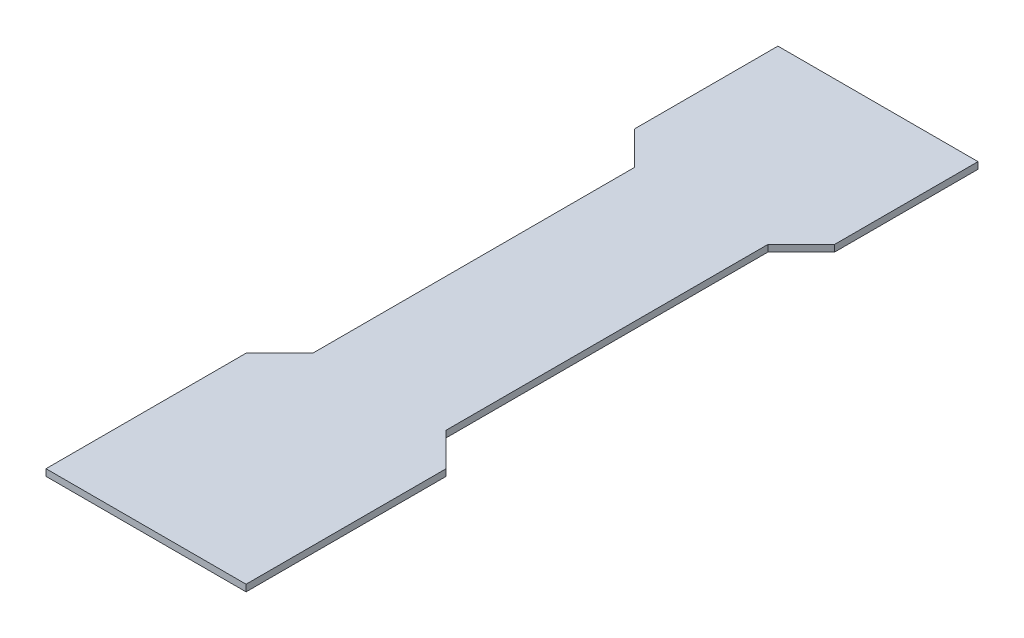
ISO-10303-21;
HEADER;
FILE_DESCRIPTION(('STEP AP214'),'2;1');
FILE_NAME('part.step','',(''),(''),'','','');
FILE_SCHEMA(('AUTOMOTIVE_DESIGN { 1 0 10303 214 1 1 1 1 }'));
ENDSEC;
DATA;
#1=APPLICATION_CONTEXT('core data for automotive mechanical design processes');
#2=APPLICATION_PROTOCOL_DEFINITION('international standard','automotive_design',2000,#1);
#3=PRODUCT_CONTEXT('',#1,'mechanical');
#4=PRODUCT('Part','Part','',(#3));
#5=PRODUCT_RELATED_PRODUCT_CATEGORY('part','',(#4));
#6=PRODUCT_DEFINITION_FORMATION('','',#4);
#7=PRODUCT_DEFINITION_CONTEXT('part definition',#1,'design');
#8=PRODUCT_DEFINITION('design','',#6,#7);
#9=PRODUCT_DEFINITION_SHAPE('','',#8);
#10=(LENGTH_UNIT() NAMED_UNIT(*) SI_UNIT(.MILLI.,.METRE.));
#11=(NAMED_UNIT(*) PLANE_ANGLE_UNIT() SI_UNIT($,.RADIAN.));
#12=(NAMED_UNIT(*) SI_UNIT($,.STERADIAN.) SOLID_ANGLE_UNIT());
#13=UNCERTAINTY_MEASURE_WITH_UNIT(LENGTH_MEASURE(1.E-05),#10,'distance_accuracy_value','');
#14=(GEOMETRIC_REPRESENTATION_CONTEXT(3) GLOBAL_UNCERTAINTY_ASSIGNED_CONTEXT((#13)) GLOBAL_UNIT_ASSIGNED_CONTEXT((#10,
#11,#12)) REPRESENTATION_CONTEXT('',''));
#15=CARTESIAN_POINT('',(0.,0.,0.));
#16=DIRECTION('',(0.,0.,1.));
#17=DIRECTION('',(1.,0.,0.));
#18=AXIS2_PLACEMENT_3D('',#15,#16,#17);
#19=CARTESIAN_POINT('',(-30.0000000000001,2.,260.));
#20=DIRECTION('',(0.707106781186549,0.,0.707106781186546));
#21=DIRECTION('',(0.707106781186546,0.,-0.707106781186549));
#22=AXIS2_PLACEMENT_3D('',#19,#20,#21);
#23=PLANE('',#22);
#24=DIRECTION('',(-0.707106781186546,0.,0.707106781186549));
#25=VECTOR('',#24,1.);
#26=CARTESIAN_POINT('',(-30.0000000000001,0.,260.));
#27=LINE('',#26,#25);
#28=CARTESIAN_POINT('',(-20.,0.,250.));
#29=VERTEX_POINT('',#28);
#30=CARTESIAN_POINT('',(-30.0000000000001,0.,260.));
#31=VERTEX_POINT('',#30);
#32=EDGE_CURVE('E168',#29,#31,#27,.T.);
#33=ORIENTED_EDGE('',*,*,#32,.T.);
#34=DIRECTION('',(0.,-1.,0.));
#35=VECTOR('',#34,1.);
#36=CARTESIAN_POINT('',(-30.0000000000001,2.,260.));
#37=LINE('',#36,#35);
#38=CARTESIAN_POINT('',(-30.0000000000001,2.,260.));
#39=VERTEX_POINT('',#38);
#40=EDGE_CURVE('E48',#39,#31,#37,.T.);
#41=ORIENTED_EDGE('',*,*,#40,.F.);
#42=DIRECTION('',(-0.707106781186546,0.,0.707106781186549));
#43=VECTOR('',#42,1.);
#44=CARTESIAN_POINT('',(-30.0000000000001,2.,260.));
#45=LINE('',#44,#43);
#46=CARTESIAN_POINT('',(-20.,2.,250.));
#47=VERTEX_POINT('',#46);
#48=EDGE_CURVE('E112',#47,#39,#45,.T.);
#49=ORIENTED_EDGE('',*,*,#48,.F.);
#50=DIRECTION('',(0.,-1.,0.));
#51=VECTOR('',#50,1.);
#52=CARTESIAN_POINT('',(-20.,2.,250.));
#53=LINE('',#52,#51);
#54=EDGE_CURVE('E11',#47,#29,#53,.T.);
#55=ORIENTED_EDGE('',*,*,#54,.T.);
#56=EDGE_LOOP('',(#33,#41,#49,#55));
#57=FACE_BOUND('',#56,.T.);
#58=ADVANCED_FACE('F39',(#57),#23,.F.);
#59=CARTESIAN_POINT('',(-30.0000000000001,2.,260.));
#60=DIRECTION('',(1.,0.,0.));
#61=DIRECTION('',(0.,0.,-1.));
#62=AXIS2_PLACEMENT_3D('',#59,#60,#61);
#63=PLANE('',#62);
#64=DIRECTION('',(0.,0.,1.));
#65=VECTOR('',#64,1.);
#66=CARTESIAN_POINT('',(-30.0000000000001,0.,260.));
#67=LINE('',#66,#65);
#68=CARTESIAN_POINT('',(-30.,0.,320.));
#69=VERTEX_POINT('',#68);
#70=EDGE_CURVE('E171',#31,#69,#67,.T.);
#71=ORIENTED_EDGE('',*,*,#70,.T.);
#72=DIRECTION('',(0.,-1.,0.));
#73=VECTOR('',#72,1.);
#74=CARTESIAN_POINT('',(-30.,2.,320.));
#75=LINE('',#74,#73);
#76=CARTESIAN_POINT('',(-30.,2.,320.));
#77=VERTEX_POINT('',#76);
#78=EDGE_CURVE('E228',#77,#69,#75,.T.);
#79=ORIENTED_EDGE('',*,*,#78,.F.);
#80=DIRECTION('',(0.,0.,1.));
#81=VECTOR('',#80,1.);
#82=CARTESIAN_POINT('',(-30.0000000000001,2.,260.));
#83=LINE('',#82,#81);
#84=EDGE_CURVE('E238',#39,#77,#83,.T.);
#85=ORIENTED_EDGE('',*,*,#84,.F.);
#86=ORIENTED_EDGE('',*,*,#40,.T.);
#87=EDGE_LOOP('',(#71,#79,#85,#86));
#88=FACE_BOUND('',#87,.T.);
#89=ADVANCED_FACE('F236',(#88),#63,.F.);
#90=CARTESIAN_POINT('',(-30.,2.,320.));
#91=DIRECTION('',(0.,0.,-1.));
#92=DIRECTION('',(-1.,0.,0.));
#93=AXIS2_PLACEMENT_3D('',#90,#91,#92);
#94=PLANE('',#93);
#95=DIRECTION('',(1.,0.,0.));
#96=VECTOR('',#95,1.);
#97=CARTESIAN_POINT('',(-30.,0.,320.));
#98=LINE('',#97,#96);
#99=CARTESIAN_POINT('',(30.,0.,320.));
#100=VERTEX_POINT('',#99);
#101=EDGE_CURVE('E174',#69,#100,#98,.T.);
#102=ORIENTED_EDGE('',*,*,#101,.T.);
#103=DIRECTION('',(0.,-1.,0.));
#104=VECTOR('',#103,1.);
#105=CARTESIAN_POINT('',(30.,2.,320.));
#106=LINE('',#105,#104);
#107=CARTESIAN_POINT('',(30.,2.,320.));
#108=VERTEX_POINT('',#107);
#109=EDGE_CURVE('E224',#108,#100,#106,.T.);
#110=ORIENTED_EDGE('',*,*,#109,.F.);
#111=DIRECTION('',(1.,0.,0.));
#112=VECTOR('',#111,1.);
#113=CARTESIAN_POINT('',(-30.,2.,320.));
#114=LINE('',#113,#112);
#115=EDGE_CURVE('E258',#77,#108,#114,.T.);
#116=ORIENTED_EDGE('',*,*,#115,.F.);
#117=ORIENTED_EDGE('',*,*,#78,.T.);
#118=EDGE_LOOP('',(#102,#110,#116,#117));
#119=FACE_BOUND('',#118,.T.);
#120=ADVANCED_FACE('F248',(#119),#94,.F.);
#121=CARTESIAN_POINT('',(30.0000000000001,2.,260.));
#122=DIRECTION('',(-1.,0.,0.));
#123=DIRECTION('',(0.,0.,1.));
#124=AXIS2_PLACEMENT_3D('',#121,#122,#123);
#125=PLANE('',#124);
#126=DIRECTION('',(0.,0.,-1.));
#127=VECTOR('',#126,1.);
#128=CARTESIAN_POINT('',(30.0000000000001,0.,260.));
#129=LINE('',#128,#127);
#130=CARTESIAN_POINT('',(30.0000000000001,0.,260.));
#131=VERTEX_POINT('',#130);
#132=EDGE_CURVE('E177',#100,#131,#129,.T.);
#133=ORIENTED_EDGE('',*,*,#132,.T.);
#134=DIRECTION('',(0.,-1.,0.));
#135=VECTOR('',#134,1.);
#136=CARTESIAN_POINT('',(30.0000000000001,2.,260.));
#137=LINE('',#136,#135);
#138=CARTESIAN_POINT('',(30.0000000000001,2.,260.));
#139=VERTEX_POINT('',#138);
#140=EDGE_CURVE('E220',#139,#131,#137,.T.);
#141=ORIENTED_EDGE('',*,*,#140,.F.);
#142=DIRECTION('',(0.,0.,-1.));
#143=VECTOR('',#142,1.);
#144=CARTESIAN_POINT('',(30.0000000000001,2.,260.));
#145=LINE('',#144,#143);
#146=EDGE_CURVE('E254',#108,#139,#145,.T.);
#147=ORIENTED_EDGE('',*,*,#146,.F.);
#148=ORIENTED_EDGE('',*,*,#109,.T.);
#149=EDGE_LOOP('',(#133,#141,#147,#148));
#150=FACE_BOUND('',#149,.T.);
#151=ADVANCED_FACE('F252',(#150),#125,.F.);
#152=CARTESIAN_POINT('',(30.0000000000001,2.,260.));
#153=DIRECTION('',(-0.707106781186549,0.,0.707106781186546));
#154=DIRECTION('',(0.707106781186546,0.,0.707106781186549));
#155=AXIS2_PLACEMENT_3D('',#152,#153,#154);
#156=PLANE('',#155);
#157=DIRECTION('',(-0.707106781186546,0.,-0.707106781186549));
#158=VECTOR('',#157,1.);
#159=CARTESIAN_POINT('',(30.0000000000001,0.,260.));
#160=LINE('',#159,#158);
#161=CARTESIAN_POINT('',(20.,0.,250.));
#162=VERTEX_POINT('',#161);
#163=EDGE_CURVE('E180',#131,#162,#160,.T.);
#164=ORIENTED_EDGE('',*,*,#163,.T.);
#165=DIRECTION('',(0.,-1.,0.));
#166=VECTOR('',#165,1.);
#167=CARTESIAN_POINT('',(20.,2.,250.));
#168=LINE('',#167,#166);
#169=CARTESIAN_POINT('',(20.,2.,250.));
#170=VERTEX_POINT('',#169);
#171=EDGE_CURVE('E216',#170,#162,#168,.T.);
#172=ORIENTED_EDGE('',*,*,#171,.F.);
#173=DIRECTION('',(-0.707106781186546,0.,-0.707106781186549));
#174=VECTOR('',#173,1.);
#175=CARTESIAN_POINT('',(30.0000000000001,2.,260.));
#176=LINE('',#175,#174);
#177=EDGE_CURVE('E257',#139,#170,#176,.T.);
#178=ORIENTED_EDGE('',*,*,#177,.F.);
#179=ORIENTED_EDGE('',*,*,#140,.T.);
#180=EDGE_LOOP('',(#164,#172,#178,#179));
#181=FACE_BOUND('',#180,.T.);
#182=ADVANCED_FACE('F308',(#181),#156,.F.);
#183=CARTESIAN_POINT('',(20.,2.,240.));
#184=DIRECTION('',(-1.,0.,0.));
#185=DIRECTION('',(0.,0.,1.));
#186=AXIS2_PLACEMENT_3D('',#183,#184,#185);
#187=PLANE('',#186);
#188=DIRECTION('',(0.,0.,-1.));
#189=VECTOR('',#188,1.);
#190=CARTESIAN_POINT('',(20.,0.,240.));
#191=LINE('',#190,#189);
#192=CARTESIAN_POINT('',(20.,0.,153.5));
#193=VERTEX_POINT('',#192);
#194=EDGE_CURVE('E184',#162,#193,#191,.T.);
#195=ORIENTED_EDGE('',*,*,#194,.T.);
#196=DIRECTION('',(0.,-1.,0.));
#197=VECTOR('',#196,1.);
#198=CARTESIAN_POINT('',(20.,2.,153.5));
#199=LINE('',#198,#197);
#200=CARTESIAN_POINT('',(20.,2.,153.5));
#201=VERTEX_POINT('',#200);
#202=EDGE_CURVE('E212',#201,#193,#199,.T.);
#203=ORIENTED_EDGE('',*,*,#202,.F.);
#204=DIRECTION('',(0.,0.,-1.));
#205=VECTOR('',#204,1.);
#206=CARTESIAN_POINT('',(20.,2.,250.));
#207=LINE('',#206,#205);
#208=EDGE_CURVE('E262',#170,#201,#207,.T.);
#209=ORIENTED_EDGE('',*,*,#208,.F.);
#210=ORIENTED_EDGE('',*,*,#171,.T.);
#211=EDGE_LOOP('',(#195,#203,#209,#210));
#212=FACE_BOUND('',#211,.T.);
#213=ADVANCED_FACE('F311',(#212),#187,.F.);
#214=CARTESIAN_POINT('',(30.,2.,143.5));
#215=DIRECTION('',(-0.707106781186539,0.,-0.707106781186556));
#216=DIRECTION('',(-0.707106781186556,0.,0.707106781186539));
#217=AXIS2_PLACEMENT_3D('',#214,#215,#216);
#218=PLANE('',#217);
#219=DIRECTION('',(0.707106781186556,0.,-0.707106781186539));
#220=VECTOR('',#219,1.);
#221=CARTESIAN_POINT('',(30.,0.,143.5));
#222=LINE('',#221,#220);
#223=CARTESIAN_POINT('',(30.,0.,143.5));
#224=VERTEX_POINT('',#223);
#225=EDGE_CURVE('E187',#193,#224,#222,.T.);
#226=ORIENTED_EDGE('',*,*,#225,.T.);
#227=DIRECTION('',(0.,-1.,0.));
#228=VECTOR('',#227,1.);
#229=CARTESIAN_POINT('',(30.,2.,143.5));
#230=LINE('',#229,#228);
#231=CARTESIAN_POINT('',(30.,2.,143.5));
#232=VERTEX_POINT('',#231);
#233=EDGE_CURVE('E208',#232,#224,#230,.T.);
#234=ORIENTED_EDGE('',*,*,#233,.F.);
#235=DIRECTION('',(0.707106781186556,0.,-0.707106781186539));
#236=VECTOR('',#235,1.);
#237=CARTESIAN_POINT('',(30.,2.,143.5));
#238=LINE('',#237,#236);
#239=EDGE_CURVE('E269',#201,#232,#238,.T.);
#240=ORIENTED_EDGE('',*,*,#239,.F.);
#241=ORIENTED_EDGE('',*,*,#202,.T.);
#242=EDGE_LOOP('',(#226,#234,#240,#241));
#243=FACE_BOUND('',#242,.T.);
#244=ADVANCED_FACE('F277',(#243),#218,.F.);
#245=CARTESIAN_POINT('',(30.,2.,143.5));
#246=DIRECTION('',(-1.,0.,0.));
#247=DIRECTION('',(0.,0.,1.));
#248=AXIS2_PLACEMENT_3D('',#245,#246,#247);
#249=PLANE('',#248);
#250=DIRECTION('',(0.,0.,-1.));
#251=VECTOR('',#250,1.);
#252=CARTESIAN_POINT('',(30.,0.,143.5));
#253=LINE('',#252,#251);
#254=CARTESIAN_POINT('',(29.9999999999998,0.,100.5));
#255=VERTEX_POINT('',#254);
#256=EDGE_CURVE('E190',#224,#255,#253,.T.);
#257=ORIENTED_EDGE('',*,*,#256,.T.);
#258=DIRECTION('',(0.,-1.,0.));
#259=VECTOR('',#258,1.);
#260=CARTESIAN_POINT('',(29.9999999999998,2.,100.5));
#261=LINE('',#260,#259);
#262=CARTESIAN_POINT('',(29.9999999999998,2.,100.5));
#263=VERTEX_POINT('',#262);
#264=EDGE_CURVE('E155',#263,#255,#261,.T.);
#265=ORIENTED_EDGE('',*,*,#264,.F.);
#266=DIRECTION('',(0.,0.,-1.));
#267=VECTOR('',#266,1.);
#268=CARTESIAN_POINT('',(30.,2.,143.5));
#269=LINE('',#268,#267);
#270=EDGE_CURVE('E144',#232,#263,#269,.T.);
#271=ORIENTED_EDGE('',*,*,#270,.F.);
#272=ORIENTED_EDGE('',*,*,#233,.T.);
#273=EDGE_LOOP('',(#257,#265,#271,#272));
#274=FACE_BOUND('',#273,.T.);
#275=ADVANCED_FACE('F281',(#274),#249,.F.);
#276=CARTESIAN_POINT('',(-29.9999999999998,2.,100.5));
#277=DIRECTION('',(0.,0.,1.));
#278=DIRECTION('',(1.,0.,0.));
#279=AXIS2_PLACEMENT_3D('',#276,#277,#278);
#280=PLANE('',#279);
#281=DIRECTION('',(-1.,0.,0.));
#282=VECTOR('',#281,1.);
#283=CARTESIAN_POINT('',(-29.9999999999998,0.,100.5));
#284=LINE('',#283,#282);
#285=CARTESIAN_POINT('',(-29.9999999999998,0.,100.5));
#286=VERTEX_POINT('',#285);
#287=EDGE_CURVE('E153',#255,#286,#284,.T.);
#288=ORIENTED_EDGE('',*,*,#287,.T.);
#289=DIRECTION('',(0.,-1.,0.));
#290=VECTOR('',#289,1.);
#291=CARTESIAN_POINT('',(-29.9999999999998,2.,100.5));
#292=LINE('',#291,#290);
#293=CARTESIAN_POINT('',(-29.9999999999998,2.,100.5));
#294=VERTEX_POINT('',#293);
#295=EDGE_CURVE('E150',#294,#286,#292,.T.);
#296=ORIENTED_EDGE('',*,*,#295,.F.);
#297=DIRECTION('',(-1.,0.,0.));
#298=VECTOR('',#297,1.);
#299=CARTESIAN_POINT('',(-29.9999999999998,2.,100.5));
#300=LINE('',#299,#298);
#301=EDGE_CURVE('E138',#263,#294,#300,.T.);
#302=ORIENTED_EDGE('',*,*,#301,.F.);
#303=ORIENTED_EDGE('',*,*,#264,.T.);
#304=EDGE_LOOP('',(#288,#296,#302,#303));
#305=FACE_BOUND('',#304,.T.);
#306=ADVANCED_FACE('F151',(#305),#280,.F.);
#307=CARTESIAN_POINT('',(-30.,2.,143.5));
#308=DIRECTION('',(1.,0.,0.));
#309=DIRECTION('',(0.,0.,-1.));
#310=AXIS2_PLACEMENT_3D('',#307,#308,#309);
#311=PLANE('',#310);
#312=DIRECTION('',(0.,0.,1.));
#313=VECTOR('',#312,1.);
#314=CARTESIAN_POINT('',(-30.,0.,143.5));
#315=LINE('',#314,#313);
#316=CARTESIAN_POINT('',(-30.,0.,143.5));
#317=VERTEX_POINT('',#316);
#318=EDGE_CURVE('E98',#286,#317,#315,.T.);
#319=ORIENTED_EDGE('',*,*,#318,.T.);
#320=DIRECTION('',(0.,-1.,0.));
#321=VECTOR('',#320,1.);
#322=CARTESIAN_POINT('',(-30.,2.,143.5));
#323=LINE('',#322,#321);
#324=CARTESIAN_POINT('',(-30.,2.,143.5));
#325=VERTEX_POINT('',#324);
#326=EDGE_CURVE('E156',#325,#317,#323,.T.);
#327=ORIENTED_EDGE('',*,*,#326,.F.);
#328=DIRECTION('',(0.,0.,1.));
#329=VECTOR('',#328,1.);
#330=CARTESIAN_POINT('',(-30.,2.,143.5));
#331=LINE('',#330,#329);
#332=EDGE_CURVE('E142',#294,#325,#331,.T.);
#333=ORIENTED_EDGE('',*,*,#332,.F.);
#334=ORIENTED_EDGE('',*,*,#295,.T.);
#335=EDGE_LOOP('',(#319,#327,#333,#334));
#336=FACE_BOUND('',#335,.T.);
#337=ADVANCED_FACE('F158',(#336),#311,.F.);
#338=CARTESIAN_POINT('',(-30.,2.,143.5));
#339=DIRECTION('',(0.707106781186539,0.,-0.707106781186556));
#340=DIRECTION('',(-0.707106781186556,0.,-0.707106781186539));
#341=AXIS2_PLACEMENT_3D('',#338,#339,#340);
#342=PLANE('',#341);
#343=DIRECTION('',(0.707106781186556,0.,0.707106781186539));
#344=VECTOR('',#343,1.);
#345=CARTESIAN_POINT('',(-30.,0.,143.5));
#346=LINE('',#345,#344);
#347=CARTESIAN_POINT('',(-20.,0.,153.5));
#348=VERTEX_POINT('',#347);
#349=EDGE_CURVE('E105',#317,#348,#346,.T.);
#350=ORIENTED_EDGE('',*,*,#349,.T.);
#351=DIRECTION('',(0.,-1.,0.));
#352=VECTOR('',#351,1.);
#353=CARTESIAN_POINT('',(-20.,2.,153.5));
#354=LINE('',#353,#352);
#355=CARTESIAN_POINT('',(-20.,2.,153.5));
#356=VERTEX_POINT('',#355);
#357=EDGE_CURVE('E164',#356,#348,#354,.T.);
#358=ORIENTED_EDGE('',*,*,#357,.F.);
#359=DIRECTION('',(0.707106781186556,0.,0.707106781186539));
#360=VECTOR('',#359,1.);
#361=CARTESIAN_POINT('',(-30.,2.,143.5));
#362=LINE('',#361,#360);
#363=EDGE_CURVE('E161',#325,#356,#362,.T.);
#364=ORIENTED_EDGE('',*,*,#363,.F.);
#365=ORIENTED_EDGE('',*,*,#326,.T.);
#366=EDGE_LOOP('',(#350,#358,#364,#365));
#367=FACE_BOUND('',#366,.T.);
#368=ADVANCED_FACE('F283',(#367),#342,.F.);
#369=CARTESIAN_POINT('',(-20.,2.,240.));
#370=DIRECTION('',(1.,0.,0.));
#371=DIRECTION('',(0.,0.,-1.));
#372=AXIS2_PLACEMENT_3D('',#369,#370,#371);
#373=PLANE('',#372);
#374=DIRECTION('',(0.,0.,1.));
#375=VECTOR('',#374,1.);
#376=CARTESIAN_POINT('',(-20.,0.,240.));
#377=LINE('',#376,#375);
#378=EDGE_CURVE('E199',#348,#29,#377,.T.);
#379=ORIENTED_EDGE('',*,*,#378,.T.);
#380=ORIENTED_EDGE('',*,*,#54,.F.);
#381=DIRECTION('',(0.,0.,1.));
#382=VECTOR('',#381,1.);
#383=CARTESIAN_POINT('',(-20.,2.,250.));
#384=LINE('',#383,#382);
#385=EDGE_CURVE('E56',#356,#47,#384,.T.);
#386=ORIENTED_EDGE('',*,*,#385,.F.);
#387=ORIENTED_EDGE('',*,*,#357,.T.);
#388=EDGE_LOOP('',(#379,#380,#386,#387));
#389=FACE_BOUND('',#388,.T.);
#390=ADVANCED_FACE('F282',(#389),#373,.F.);
#391=CARTESIAN_POINT('',(0.,2.,0.));
#392=DIRECTION('',(0.,-1.,0.));
#393=DIRECTION('',(0.,0.,-1.));
#394=AXIS2_PLACEMENT_3D('',#391,#392,#393);
#395=PLANE('',#394);
#396=ORIENTED_EDGE('',*,*,#385,.T.);
#397=ORIENTED_EDGE('',*,*,#48,.T.);
#398=ORIENTED_EDGE('',*,*,#84,.T.);
#399=ORIENTED_EDGE('',*,*,#115,.T.);
#400=ORIENTED_EDGE('',*,*,#146,.T.);
#401=ORIENTED_EDGE('',*,*,#177,.T.);
#402=ORIENTED_EDGE('',*,*,#208,.T.);
#403=ORIENTED_EDGE('',*,*,#239,.T.);
#404=ORIENTED_EDGE('',*,*,#270,.T.);
#405=ORIENTED_EDGE('',*,*,#301,.T.);
#406=ORIENTED_EDGE('',*,*,#332,.T.);
#407=ORIENTED_EDGE('',*,*,#363,.T.);
#408=EDGE_LOOP('',(#396,#397,#398,#399,#400,#401,#402,#403,#404,#405,#406,#407));
#409=FACE_BOUND('',#408,.T.);
#410=ADVANCED_FACE('F140',(#409),#395,.F.);
#411=CARTESIAN_POINT('',(0.,0.,0.));
#412=DIRECTION('',(0.,-1.,0.));
#413=DIRECTION('',(0.,0.,-1.));
#414=AXIS2_PLACEMENT_3D('',#411,#412,#413);
#415=PLANE('',#414);
#416=ORIENTED_EDGE('',*,*,#32,.F.);
#417=ORIENTED_EDGE('',*,*,#378,.F.);
#418=ORIENTED_EDGE('',*,*,#349,.F.);
#419=ORIENTED_EDGE('',*,*,#318,.F.);
#420=ORIENTED_EDGE('',*,*,#287,.F.);
#421=ORIENTED_EDGE('',*,*,#256,.F.);
#422=ORIENTED_EDGE('',*,*,#225,.F.);
#423=ORIENTED_EDGE('',*,*,#194,.F.);
#424=ORIENTED_EDGE('',*,*,#163,.F.);
#425=ORIENTED_EDGE('',*,*,#132,.F.);
#426=ORIENTED_EDGE('',*,*,#101,.F.);
#427=ORIENTED_EDGE('',*,*,#70,.F.);
#428=EDGE_LOOP('',(#416,#417,#418,#419,#420,#421,#422,#423,#424,#425,#426,#427));
#429=FACE_BOUND('',#428,.T.);
#430=ADVANCED_FACE('F242',(#429),#415,.T.);
#431=CLOSED_SHELL('',(#58,#89,#120,#151,#182,#213,#244,#275,#306,#337,#368,#390,#410,#430));
#432=MANIFOLD_SOLID_BREP('B2',#431);
#433=ADVANCED_BREP_SHAPE_REPRESENTATION('',(#18,#432),#14);
#434=SHAPE_DEFINITION_REPRESENTATION(#9,#433);
ENDSEC;
END-ISO-10303-21;
